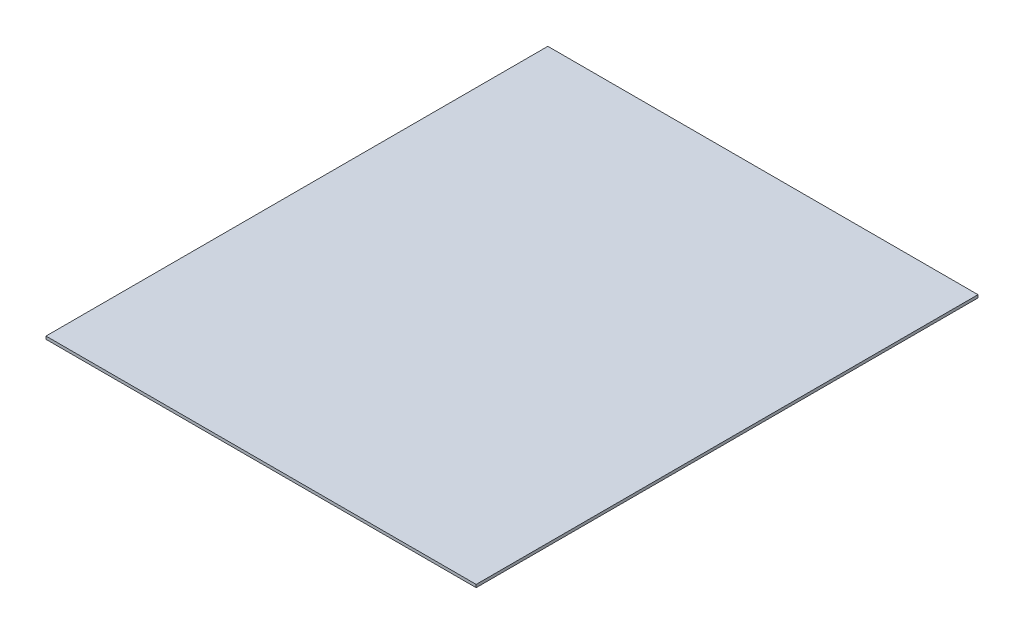
ISO-10303-21;
HEADER;
FILE_DESCRIPTION(('STEP AP214'),'2;1');
FILE_NAME('part.step','',(''),(''),'','','');
FILE_SCHEMA(('AUTOMOTIVE_DESIGN { 1 0 10303 214 1 1 1 1 }'));
ENDSEC;
DATA;
#1=APPLICATION_CONTEXT('core data for automotive mechanical design processes');
#2=APPLICATION_PROTOCOL_DEFINITION('international standard','automotive_design',2000,#1);
#3=PRODUCT_CONTEXT('',#1,'mechanical');
#4=PRODUCT('Part','Part','',(#3));
#5=PRODUCT_RELATED_PRODUCT_CATEGORY('part','',(#4));
#6=PRODUCT_DEFINITION_FORMATION('','',#4);
#7=PRODUCT_DEFINITION_CONTEXT('part definition',#1,'design');
#8=PRODUCT_DEFINITION('design','',#6,#7);
#9=PRODUCT_DEFINITION_SHAPE('','',#8);
#10=(LENGTH_UNIT() NAMED_UNIT(*) SI_UNIT(.MILLI.,.METRE.));
#11=(NAMED_UNIT(*) PLANE_ANGLE_UNIT() SI_UNIT($,.RADIAN.));
#12=(NAMED_UNIT(*) SI_UNIT($,.STERADIAN.) SOLID_ANGLE_UNIT());
#13=UNCERTAINTY_MEASURE_WITH_UNIT(LENGTH_MEASURE(1.E-05),#10,'distance_accuracy_value','');
#14=(GEOMETRIC_REPRESENTATION_CONTEXT(3) GLOBAL_UNCERTAINTY_ASSIGNED_CONTEXT((#13)) GLOBAL_UNIT_ASSIGNED_CONTEXT((#10,
#11,#12)) REPRESENTATION_CONTEXT('',''));
#15=CARTESIAN_POINT('',(0.,0.,0.));
#16=DIRECTION('',(0.,0.,1.));
#17=DIRECTION('',(1.,0.,0.));
#18=AXIS2_PLACEMENT_3D('',#15,#16,#17);
#19=CARTESIAN_POINT('',(0.,2.,0.));
#20=DIRECTION('',(-1.,0.,0.));
#21=DIRECTION('',(0.,0.,1.));
#22=AXIS2_PLACEMENT_3D('',#19,#20,#21);
#23=PLANE('',#22);
#24=DIRECTION('',(0.,0.,-1.));
#25=VECTOR('',#24,1.);
#26=CARTESIAN_POINT('',(0.,0.,0.));
#27=LINE('',#26,#25);
#28=CARTESIAN_POINT('',(0.,0.,0.));
#29=VERTEX_POINT('',#28);
#30=CARTESIAN_POINT('',(0.,0.,-350.));
#31=VERTEX_POINT('',#30);
#32=EDGE_CURVE('E96',#29,#31,#27,.T.);
#33=ORIENTED_EDGE('',*,*,#32,.T.);
#34=DIRECTION('',(0.,-1.,0.));
#35=VECTOR('',#34,1.);
#36=CARTESIAN_POINT('',(0.,2.,-350.));
#37=LINE('',#36,#35);
#38=CARTESIAN_POINT('',(0.,2.,-350.));
#39=VERTEX_POINT('',#38);
#40=EDGE_CURVE('E11',#39,#31,#37,.T.);
#41=ORIENTED_EDGE('',*,*,#40,.F.);
#42=DIRECTION('',(0.,0.,-1.));
#43=VECTOR('',#42,1.);
#44=CARTESIAN_POINT('',(0.,2.,0.));
#45=LINE('',#44,#43);
#46=CARTESIAN_POINT('',(0.,2.,0.));
#47=VERTEX_POINT('',#46);
#48=EDGE_CURVE('E84',#47,#39,#45,.T.);
#49=ORIENTED_EDGE('',*,*,#48,.F.);
#50=DIRECTION('',(0.,-1.,0.));
#51=VECTOR('',#50,1.);
#52=CARTESIAN_POINT('',(0.,2.,0.));
#53=LINE('',#52,#51);
#54=EDGE_CURVE('E92',#47,#29,#53,.T.);
#55=ORIENTED_EDGE('',*,*,#54,.T.);
#56=EDGE_LOOP('',(#33,#41,#49,#55));
#57=FACE_BOUND('',#56,.T.);
#58=ADVANCED_FACE('F33',(#57),#23,.F.);
#59=CARTESIAN_POINT('',(0.,2.,-350.));
#60=DIRECTION('',(0.,0.,1.));
#61=DIRECTION('',(1.,0.,0.));
#62=AXIS2_PLACEMENT_3D('',#59,#60,#61);
#63=PLANE('',#62);
#64=DIRECTION('',(-1.,0.,0.));
#65=VECTOR('',#64,1.);
#66=CARTESIAN_POINT('',(0.,0.,-350.));
#67=LINE('',#66,#65);
#68=CARTESIAN_POINT('',(-300.,0.,-350.));
#69=VERTEX_POINT('',#68);
#70=EDGE_CURVE('E88',#31,#69,#67,.T.);
#71=ORIENTED_EDGE('',*,*,#70,.T.);
#72=DIRECTION('',(0.,-1.,0.));
#73=VECTOR('',#72,1.);
#74=CARTESIAN_POINT('',(-300.,2.,-350.));
#75=LINE('',#74,#73);
#76=CARTESIAN_POINT('',(-300.,2.,-350.));
#77=VERTEX_POINT('',#76);
#78=EDGE_CURVE('E41',#77,#69,#75,.T.);
#79=ORIENTED_EDGE('',*,*,#78,.F.);
#80=DIRECTION('',(-1.,0.,0.));
#81=VECTOR('',#80,1.);
#82=CARTESIAN_POINT('',(0.,2.,-350.));
#83=LINE('',#82,#81);
#84=EDGE_CURVE('E79',#39,#77,#83,.T.);
#85=ORIENTED_EDGE('',*,*,#84,.F.);
#86=ORIENTED_EDGE('',*,*,#40,.T.);
#87=EDGE_LOOP('',(#71,#79,#85,#86));
#88=FACE_BOUND('',#87,.T.);
#89=ADVANCED_FACE('F87',(#88),#63,.F.);
#90=CARTESIAN_POINT('',(-300.,2.,0.));
#91=DIRECTION('',(1.,0.,0.));
#92=DIRECTION('',(0.,0.,-1.));
#93=AXIS2_PLACEMENT_3D('',#90,#91,#92);
#94=PLANE('',#93);
#95=DIRECTION('',(0.,0.,1.));
#96=VECTOR('',#95,1.);
#97=CARTESIAN_POINT('',(-300.,0.,0.));
#98=LINE('',#97,#96);
#99=CARTESIAN_POINT('',(-300.,0.,0.));
#100=VERTEX_POINT('',#99);
#101=EDGE_CURVE('E66',#69,#100,#98,.T.);
#102=ORIENTED_EDGE('',*,*,#101,.T.);
#103=DIRECTION('',(0.,-1.,0.));
#104=VECTOR('',#103,1.);
#105=CARTESIAN_POINT('',(-300.,2.,0.));
#106=LINE('',#105,#104);
#107=CARTESIAN_POINT('',(-300.,2.,0.));
#108=VERTEX_POINT('',#107);
#109=EDGE_CURVE('E89',#108,#100,#106,.T.);
#110=ORIENTED_EDGE('',*,*,#109,.F.);
#111=DIRECTION('',(0.,0.,1.));
#112=VECTOR('',#111,1.);
#113=CARTESIAN_POINT('',(-300.,2.,0.));
#114=LINE('',#113,#112);
#115=EDGE_CURVE('E82',#77,#108,#114,.T.);
#116=ORIENTED_EDGE('',*,*,#115,.F.);
#117=ORIENTED_EDGE('',*,*,#78,.T.);
#118=EDGE_LOOP('',(#102,#110,#116,#117));
#119=FACE_BOUND('',#118,.T.);
#120=ADVANCED_FACE('F90',(#119),#94,.F.);
#121=CARTESIAN_POINT('',(0.,2.,0.));
#122=DIRECTION('',(0.,0.,-1.));
#123=DIRECTION('',(-1.,0.,0.));
#124=AXIS2_PLACEMENT_3D('',#121,#122,#123);
#125=PLANE('',#124);
#126=DIRECTION('',(1.,0.,0.));
#127=VECTOR('',#126,1.);
#128=CARTESIAN_POINT('',(0.,0.,0.));
#129=LINE('',#128,#127);
#130=EDGE_CURVE('E72',#100,#29,#129,.T.);
#131=ORIENTED_EDGE('',*,*,#130,.T.);
#132=ORIENTED_EDGE('',*,*,#54,.F.);
#133=DIRECTION('',(1.,0.,0.));
#134=VECTOR('',#133,1.);
#135=CARTESIAN_POINT('',(0.,2.,0.));
#136=LINE('',#135,#134);
#137=EDGE_CURVE('E49',#108,#47,#136,.T.);
#138=ORIENTED_EDGE('',*,*,#137,.F.);
#139=ORIENTED_EDGE('',*,*,#109,.T.);
#140=EDGE_LOOP('',(#131,#132,#138,#139));
#141=FACE_BOUND('',#140,.T.);
#142=ADVANCED_FACE('F103',(#141),#125,.F.);
#143=CARTESIAN_POINT('',(0.,2.,0.));
#144=DIRECTION('',(0.,1.,0.));
#145=DIRECTION('',(0.,0.,1.));
#146=AXIS2_PLACEMENT_3D('',#143,#144,#145);
#147=PLANE('',#146);
#148=ORIENTED_EDGE('',*,*,#48,.T.);
#149=ORIENTED_EDGE('',*,*,#84,.T.);
#150=ORIENTED_EDGE('',*,*,#115,.T.);
#151=ORIENTED_EDGE('',*,*,#137,.T.);
#152=EDGE_LOOP('',(#148,#149,#150,#151));
#153=FACE_BOUND('',#152,.T.);
#154=ADVANCED_FACE('F80',(#153),#147,.T.);
#155=CARTESIAN_POINT('',(0.,0.,0.));
#156=DIRECTION('',(0.,1.,0.));
#157=DIRECTION('',(0.,0.,1.));
#158=AXIS2_PLACEMENT_3D('',#155,#156,#157);
#159=PLANE('',#158);
#160=ORIENTED_EDGE('',*,*,#32,.F.);
#161=ORIENTED_EDGE('',*,*,#130,.F.);
#162=ORIENTED_EDGE('',*,*,#101,.F.);
#163=ORIENTED_EDGE('',*,*,#70,.F.);
#164=EDGE_LOOP('',(#160,#161,#162,#163));
#165=FACE_BOUND('',#164,.T.);
#166=ADVANCED_FACE('F106',(#165),#159,.F.);
#167=CLOSED_SHELL('',(#58,#89,#120,#142,#154,#166));
#168=MANIFOLD_SOLID_BREP('B2',#167);
#169=ADVANCED_BREP_SHAPE_REPRESENTATION('',(#18,#168),#14);
#170=SHAPE_DEFINITION_REPRESENTATION(#9,#169);
ENDSEC;
END-ISO-10303-21;
